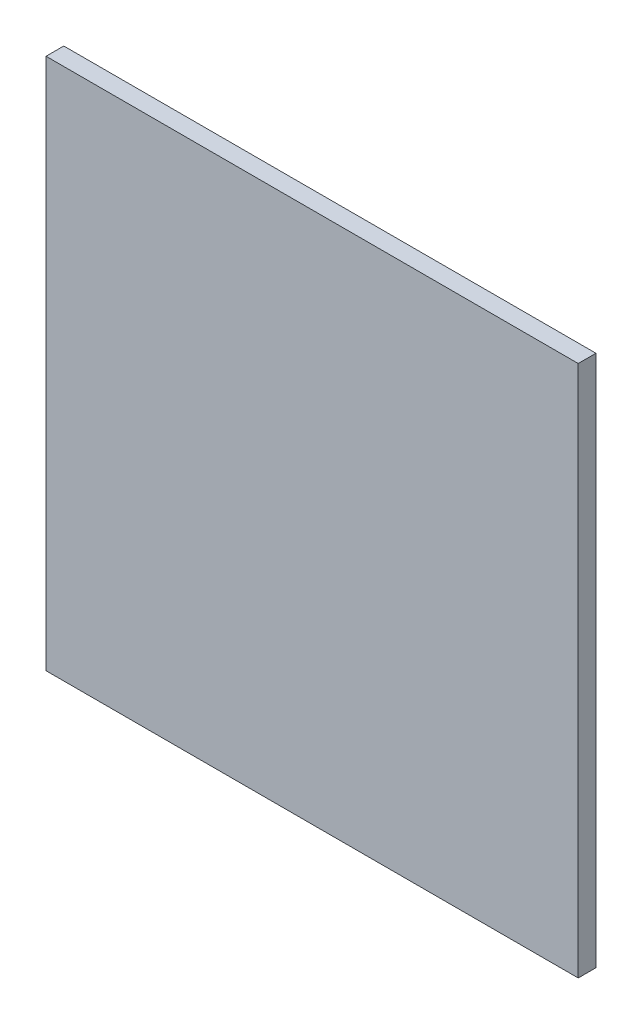
ISO-10303-21;
HEADER;
FILE_DESCRIPTION(('STEP AP214'),'2;1');
FILE_NAME('part.step','',(''),(''),'','','');
FILE_SCHEMA(('AUTOMOTIVE_DESIGN { 1 0 10303 214 1 1 1 1 }'));
ENDSEC;
DATA;
#1=APPLICATION_CONTEXT('core data for automotive mechanical design processes');
#2=APPLICATION_PROTOCOL_DEFINITION('international standard','automotive_design',2000,#1);
#3=PRODUCT_CONTEXT('',#1,'mechanical');
#4=PRODUCT('Part','Part','',(#3));
#5=PRODUCT_RELATED_PRODUCT_CATEGORY('part','',(#4));
#6=PRODUCT_DEFINITION_FORMATION('','',#4);
#7=PRODUCT_DEFINITION_CONTEXT('part definition',#1,'design');
#8=PRODUCT_DEFINITION('design','',#6,#7);
#9=PRODUCT_DEFINITION_SHAPE('','',#8);
#10=(LENGTH_UNIT() NAMED_UNIT(*) SI_UNIT(.MILLI.,.METRE.));
#11=(NAMED_UNIT(*) PLANE_ANGLE_UNIT() SI_UNIT($,.RADIAN.));
#12=(NAMED_UNIT(*) SI_UNIT($,.STERADIAN.) SOLID_ANGLE_UNIT());
#13=UNCERTAINTY_MEASURE_WITH_UNIT(LENGTH_MEASURE(1.E-05),#10,'distance_accuracy_value','');
#14=(GEOMETRIC_REPRESENTATION_CONTEXT(3) GLOBAL_UNCERTAINTY_ASSIGNED_CONTEXT((#13)) GLOBAL_UNIT_ASSIGNED_CONTEXT((#10,
#11,#12)) REPRESENTATION_CONTEXT('',''));
#15=CARTESIAN_POINT('',(0.,0.,0.));
#16=DIRECTION('',(0.,0.,1.));
#17=DIRECTION('',(1.,0.,0.));
#18=AXIS2_PLACEMENT_3D('',#15,#16,#17);
#19=CARTESIAN_POINT('',(1500.,1500.,-100.));
#20=DIRECTION('',(1.,0.,0.));
#21=DIRECTION('',(0.,1.,0.));
#22=AXIS2_PLACEMENT_3D('',#19,#20,#21);
#23=PLANE('',#22);
#24=DIRECTION('',(0.,1.,0.));
#25=VECTOR('',#24,1.);
#26=CARTESIAN_POINT('',(1500.,1500.,0.));
#27=LINE('',#26,#25);
#28=CARTESIAN_POINT('',(1500.,-1500.,0.));
#29=VERTEX_POINT('',#28);
#30=CARTESIAN_POINT('',(1500.,1500.,0.));
#31=VERTEX_POINT('',#30);
#32=EDGE_CURVE('E97',#29,#31,#27,.T.);
#33=ORIENTED_EDGE('',*,*,#32,.F.);
#34=DIRECTION('',(0.,0.,1.));
#35=VECTOR('',#34,1.);
#36=CARTESIAN_POINT('',(1500.,-1500.,-100.));
#37=LINE('',#36,#35);
#38=CARTESIAN_POINT('',(1500.,-1500.,-100.));
#39=VERTEX_POINT('',#38);
#40=EDGE_CURVE('E11',#39,#29,#37,.T.);
#41=ORIENTED_EDGE('',*,*,#40,.F.);
#42=DIRECTION('',(0.,1.,0.));
#43=VECTOR('',#42,1.);
#44=CARTESIAN_POINT('',(1500.,1500.,-100.));
#45=LINE('',#44,#43);
#46=CARTESIAN_POINT('',(1500.,1500.,-100.));
#47=VERTEX_POINT('',#46);
#48=EDGE_CURVE('E91',#39,#47,#45,.T.);
#49=ORIENTED_EDGE('',*,*,#48,.T.);
#50=DIRECTION('',(0.,0.,1.));
#51=VECTOR('',#50,1.);
#52=CARTESIAN_POINT('',(1500.,1500.,-100.));
#53=LINE('',#52,#51);
#54=EDGE_CURVE('E36',#47,#31,#53,.T.);
#55=ORIENTED_EDGE('',*,*,#54,.T.);
#56=EDGE_LOOP('',(#33,#41,#49,#55));
#57=FACE_BOUND('',#56,.T.);
#58=ADVANCED_FACE('F33',(#57),#23,.T.);
#59=CARTESIAN_POINT('',(-1500.,-1500.,-100.));
#60=DIRECTION('',(0.,-1.,0.));
#61=DIRECTION('',(0.,0.,-1.));
#62=AXIS2_PLACEMENT_3D('',#59,#60,#61);
#63=PLANE('',#62);
#64=DIRECTION('',(1.,0.,0.));
#65=VECTOR('',#64,1.);
#66=CARTESIAN_POINT('',(-1500.,-1500.,0.));
#67=LINE('',#66,#65);
#68=CARTESIAN_POINT('',(-1500.,-1500.,0.));
#69=VERTEX_POINT('',#68);
#70=EDGE_CURVE('E93',#69,#29,#67,.T.);
#71=ORIENTED_EDGE('',*,*,#70,.F.);
#72=DIRECTION('',(0.,0.,1.));
#73=VECTOR('',#72,1.);
#74=CARTESIAN_POINT('',(-1500.,-1500.,-100.));
#75=LINE('',#74,#73);
#76=CARTESIAN_POINT('',(-1500.,-1500.,-100.));
#77=VERTEX_POINT('',#76);
#78=EDGE_CURVE('E42',#77,#69,#75,.T.);
#79=ORIENTED_EDGE('',*,*,#78,.F.);
#80=DIRECTION('',(1.,0.,0.));
#81=VECTOR('',#80,1.);
#82=CARTESIAN_POINT('',(-1500.,-1500.,-100.));
#83=LINE('',#82,#81);
#84=EDGE_CURVE('E88',#77,#39,#83,.T.);
#85=ORIENTED_EDGE('',*,*,#84,.T.);
#86=ORIENTED_EDGE('',*,*,#40,.T.);
#87=EDGE_LOOP('',(#71,#79,#85,#86));
#88=FACE_BOUND('',#87,.T.);
#89=ADVANCED_FACE('F107',(#88),#63,.T.);
#90=CARTESIAN_POINT('',(-1500.,1500.,-100.));
#91=DIRECTION('',(-1.,0.,0.));
#92=DIRECTION('',(0.,-1.,0.));
#93=AXIS2_PLACEMENT_3D('',#90,#91,#92);
#94=PLANE('',#93);
#95=DIRECTION('',(0.,-1.,0.));
#96=VECTOR('',#95,1.);
#97=CARTESIAN_POINT('',(-1500.,1500.,0.));
#98=LINE('',#97,#96);
#99=CARTESIAN_POINT('',(-1500.,1500.,0.));
#100=VERTEX_POINT('',#99);
#101=EDGE_CURVE('E83',#100,#69,#98,.T.);
#102=ORIENTED_EDGE('',*,*,#101,.F.);
#103=DIRECTION('',(0.,0.,1.));
#104=VECTOR('',#103,1.);
#105=CARTESIAN_POINT('',(-1500.,1500.,-100.));
#106=LINE('',#105,#104);
#107=CARTESIAN_POINT('',(-1500.,1500.,-100.));
#108=VERTEX_POINT('',#107);
#109=EDGE_CURVE('E78',#108,#100,#106,.T.);
#110=ORIENTED_EDGE('',*,*,#109,.F.);
#111=DIRECTION('',(0.,-1.,0.));
#112=VECTOR('',#111,1.);
#113=CARTESIAN_POINT('',(-1500.,1500.,-100.));
#114=LINE('',#113,#112);
#115=EDGE_CURVE('E81',#108,#77,#114,.T.);
#116=ORIENTED_EDGE('',*,*,#115,.T.);
#117=ORIENTED_EDGE('',*,*,#78,.T.);
#118=EDGE_LOOP('',(#102,#110,#116,#117));
#119=FACE_BOUND('',#118,.T.);
#120=ADVANCED_FACE('F80',(#119),#94,.T.);
#121=CARTESIAN_POINT('',(-1500.,1500.,-100.));
#122=DIRECTION('',(0.,1.,0.));
#123=DIRECTION('',(0.,0.,1.));
#124=AXIS2_PLACEMENT_3D('',#121,#122,#123);
#125=PLANE('',#124);
#126=DIRECTION('',(-1.,0.,0.));
#127=VECTOR('',#126,1.);
#128=CARTESIAN_POINT('',(-1500.,1500.,0.));
#129=LINE('',#128,#127);
#130=EDGE_CURVE('E100',#31,#100,#129,.T.);
#131=ORIENTED_EDGE('',*,*,#130,.F.);
#132=ORIENTED_EDGE('',*,*,#54,.F.);
#133=DIRECTION('',(-1.,0.,0.));
#134=VECTOR('',#133,1.);
#135=CARTESIAN_POINT('',(-1500.,1500.,-100.));
#136=LINE('',#135,#134);
#137=EDGE_CURVE('E87',#47,#108,#136,.T.);
#138=ORIENTED_EDGE('',*,*,#137,.T.);
#139=ORIENTED_EDGE('',*,*,#109,.T.);
#140=EDGE_LOOP('',(#131,#132,#138,#139));
#141=FACE_BOUND('',#140,.T.);
#142=ADVANCED_FACE('F90',(#141),#125,.T.);
#143=CARTESIAN_POINT('',(0.,0.,-100.));
#144=DIRECTION('',(0.,0.,1.));
#145=DIRECTION('',(1.,0.,0.));
#146=AXIS2_PLACEMENT_3D('',#143,#144,#145);
#147=PLANE('',#146);
#148=ORIENTED_EDGE('',*,*,#48,.F.);
#149=ORIENTED_EDGE('',*,*,#84,.F.);
#150=ORIENTED_EDGE('',*,*,#115,.F.);
#151=ORIENTED_EDGE('',*,*,#137,.F.);
#152=EDGE_LOOP('',(#148,#149,#150,#151));
#153=FACE_BOUND('',#152,.T.);
#154=ADVANCED_FACE('F86',(#153),#147,.F.);
#155=CARTESIAN_POINT('',(0.,0.,0.));
#156=DIRECTION('',(0.,0.,1.));
#157=DIRECTION('',(1.,0.,0.));
#158=AXIS2_PLACEMENT_3D('',#155,#156,#157);
#159=PLANE('',#158);
#160=ORIENTED_EDGE('',*,*,#32,.T.);
#161=ORIENTED_EDGE('',*,*,#130,.T.);
#162=ORIENTED_EDGE('',*,*,#101,.T.);
#163=ORIENTED_EDGE('',*,*,#70,.T.);
#164=EDGE_LOOP('',(#160,#161,#162,#163));
#165=FACE_BOUND('',#164,.T.);
#166=ADVANCED_FACE('F106',(#165),#159,.T.);
#167=CLOSED_SHELL('',(#58,#89,#120,#142,#154,#166));
#168=MANIFOLD_SOLID_BREP('B2',#167);
#169=ADVANCED_BREP_SHAPE_REPRESENTATION('',(#18,#168),#14);
#170=SHAPE_DEFINITION_REPRESENTATION(#9,#169);
ENDSEC;
END-ISO-10303-21;
